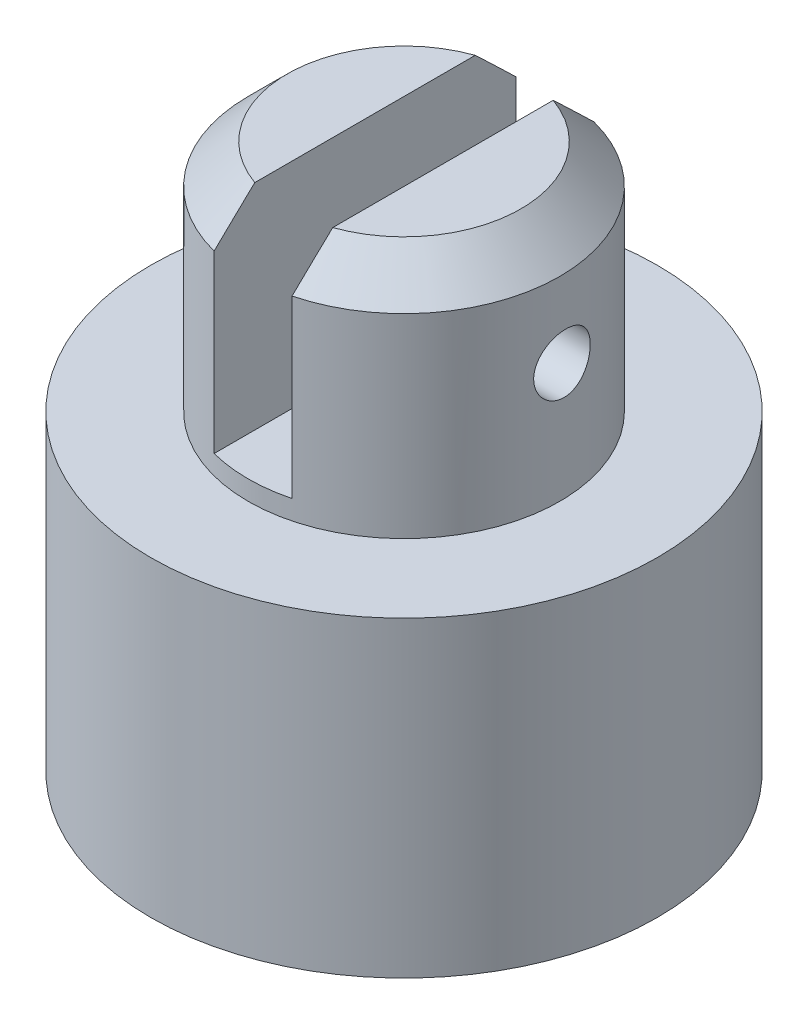
ISO-10303-21;
HEADER;
FILE_DESCRIPTION(('STEP AP214'),'2;1');
FILE_NAME('part.step','',(''),(''),'','','');
FILE_SCHEMA(('AUTOMOTIVE_DESIGN { 1 0 10303 214 1 1 1 1 }'));
ENDSEC;
DATA;
#1=APPLICATION_CONTEXT('core data for automotive mechanical design processes');
#2=APPLICATION_PROTOCOL_DEFINITION('international standard','automotive_design',2000,#1);
#3=PRODUCT_CONTEXT('',#1,'mechanical');
#4=PRODUCT('Part','Part','',(#3));
#5=PRODUCT_RELATED_PRODUCT_CATEGORY('part','',(#4));
#6=PRODUCT_DEFINITION_FORMATION('','',#4);
#7=PRODUCT_DEFINITION_CONTEXT('part definition',#1,'design');
#8=PRODUCT_DEFINITION('design','',#6,#7);
#9=PRODUCT_DEFINITION_SHAPE('','',#8);
#10=(LENGTH_UNIT() NAMED_UNIT(*) SI_UNIT(.MILLI.,.METRE.));
#11=(NAMED_UNIT(*) PLANE_ANGLE_UNIT() SI_UNIT($,.RADIAN.));
#12=(NAMED_UNIT(*) SI_UNIT($,.STERADIAN.) SOLID_ANGLE_UNIT());
#13=UNCERTAINTY_MEASURE_WITH_UNIT(LENGTH_MEASURE(1.E-05),#10,'distance_accuracy_value','');
#14=(GEOMETRIC_REPRESENTATION_CONTEXT(3) GLOBAL_UNCERTAINTY_ASSIGNED_CONTEXT((#13)) GLOBAL_UNIT_ASSIGNED_CONTEXT((#10,
#11,#12)) REPRESENTATION_CONTEXT('',''));
#15=CARTESIAN_POINT('',(0.,0.,0.));
#16=DIRECTION('',(0.,0.,1.));
#17=DIRECTION('',(1.,0.,0.));
#18=AXIS2_PLACEMENT_3D('',#15,#16,#17);
#19=CARTESIAN_POINT('',(0.,14.,0.));
#20=DIRECTION('',(0.,-1.,0.));
#21=DIRECTION('',(0.,0.,-1.));
#22=AXIS2_PLACEMENT_3D('',#19,#20,#21);
#23=CYLINDRICAL_SURFACE('',#22,4.);
#24=DIRECTION('',(0.,-1.,0.));
#25=VECTOR('',#24,1.);
#26=CARTESIAN_POINT('',(-1.,14.,3.87298334620742));
#27=LINE('',#26,#25);
#28=CARTESIAN_POINT('',(-1.,8.5,3.87298334620742));
#29=VERTEX_POINT('',#28);
#30=CARTESIAN_POINT('',(-1.,13.,3.87298334620742));
#31=VERTEX_POINT('',#30);
#32=EDGE_CURVE('E108',#29,#31,#27,.F.);
#33=ORIENTED_EDGE('',*,*,#32,.T.);
#34=CARTESIAN_POINT('',(0.,13.,0.));
#35=DIRECTION('',(0.,1.,0.));
#36=DIRECTION('',(0.,0.,1.));
#37=AXIS2_PLACEMENT_3D('',#34,#35,#36);
#38=CIRCLE('',#37,4.);
#39=CARTESIAN_POINT('',(-1.,13.,-3.87298334620742));
#40=VERTEX_POINT('',#39);
#41=EDGE_CURVE('E11',#31,#40,#38,.F.);
#42=ORIENTED_EDGE('',*,*,#41,.T.);
#43=DIRECTION('',(0.,-1.,0.));
#44=VECTOR('',#43,1.);
#45=CARTESIAN_POINT('',(-1.,14.,-3.87298334620742));
#46=LINE('',#45,#44);
#47=CARTESIAN_POINT('',(-1.,8.5,-3.87298334620742));
#48=VERTEX_POINT('',#47);
#49=EDGE_CURVE('E99',#40,#48,#46,.T.);
#50=ORIENTED_EDGE('',*,*,#49,.T.);
#51=CARTESIAN_POINT('',(0.,8.5,0.));
#52=DIRECTION('',(0.,-1.,0.));
#53=DIRECTION('',(0.,0.,-1.));
#54=AXIS2_PLACEMENT_3D('',#51,#52,#53);
#55=CIRCLE('',#54,4.);
#56=CARTESIAN_POINT('',(1.,8.5,-3.87298334620742));
#57=VERTEX_POINT('',#56);
#58=EDGE_CURVE('E103',#48,#57,#55,.T.);
#59=ORIENTED_EDGE('',*,*,#58,.T.);
#60=DIRECTION('',(0.,-1.,0.));
#61=VECTOR('',#60,1.);
#62=CARTESIAN_POINT('',(1.,14.,-3.87298334620742));
#63=LINE('',#62,#61);
#64=CARTESIAN_POINT('',(1.,13.,-3.87298334620742));
#65=VERTEX_POINT('',#64);
#66=EDGE_CURVE('E107',#57,#65,#63,.F.);
#67=ORIENTED_EDGE('',*,*,#66,.T.);
#68=CARTESIAN_POINT('',(0.,13.,0.));
#69=DIRECTION('',(0.,1.,0.));
#70=DIRECTION('',(0.,0.,1.));
#71=AXIS2_PLACEMENT_3D('',#68,#69,#70);
#72=CIRCLE('',#71,4.);
#73=CARTESIAN_POINT('',(1.,13.,3.87298334620742));
#74=VERTEX_POINT('',#73);
#75=EDGE_CURVE('E310',#65,#74,#72,.F.);
#76=ORIENTED_EDGE('',*,*,#75,.T.);
#77=DIRECTION('',(0.,-1.,0.));
#78=VECTOR('',#77,1.);
#79=CARTESIAN_POINT('',(1.,14.,3.87298334620742));
#80=LINE('',#79,#78);
#81=CARTESIAN_POINT('',(1.,8.5,3.87298334620742));
#82=VERTEX_POINT('',#81);
#83=EDGE_CURVE('E135',#74,#82,#80,.T.);
#84=ORIENTED_EDGE('',*,*,#83,.T.);
#85=EDGE_CURVE('E120',#82,#29,#55,.T.);
#86=ORIENTED_EDGE('',*,*,#85,.T.);
#87=EDGE_LOOP('',(#33,#42,#50,#59,#67,#76,#84,#86));
#88=FACE_BOUND('',#87,.T.);
#89=CARTESIAN_POINT('',(0.,8.,0.));
#90=DIRECTION('',(0.,1.,0.));
#91=DIRECTION('',(0.,0.,1.));
#92=AXIS2_PLACEMENT_3D('',#89,#90,#91);
#93=CIRCLE('',#92,4.);
#94=CARTESIAN_POINT('',(0.,8.,4.));
#95=VERTEX_POINT('',#94);
#96=EDGE_CURVE('E139',#95,#95,#93,.T.);
#97=ORIENTED_EDGE('',*,*,#96,.T.);
#98=EDGE_LOOP('',(#97));
#99=FACE_BOUND('',#98,.T.);
#100=CARTESIAN_POINT('',(-3.95118865031122,11.0026900778099,0.622983346207417));
#101=CARTESIAN_POINT('',(-3.95118940049982,11.0445645268681,0.622981765630022));
#102=CARTESIAN_POINT('',(-3.95174835865621,11.0864597613555,0.619464857560846));
#103=CARTESIAN_POINT('',(-3.95391234242121,11.1690733812183,0.605495914282408));
#104=CARTESIAN_POINT('',(-3.95551825089201,11.2097907430366,0.595038025815435));
#105=CARTESIAN_POINT('',(-3.95956139440314,11.2888457740998,0.567508407905394));
#106=CARTESIAN_POINT('',(-3.96199799144498,11.3271852430208,0.550441752868567));
#107=CARTESIAN_POINT('',(-3.96738184008181,11.4004559584785,0.51018800723455));
#108=CARTESIAN_POINT('',(-3.97032904218471,11.435387534824,0.487001509709321));
#109=CARTESIAN_POINT('',(-3.97636953863099,11.5011619296717,0.434942999350673));
#110=CARTESIAN_POINT('',(-3.97946380375205,11.5319702396767,0.406027486805999));
#111=CARTESIAN_POINT('',(-3.98535409024654,11.5883181765039,0.343422922733898));
#112=CARTESIAN_POINT('',(-3.98815010079008,11.6138576120397,0.309733697971881));
#113=CARTESIAN_POINT('',(-3.99304913938079,11.6590067447851,0.238407422398824));
#114=CARTESIAN_POINT('',(-3.99515016865386,11.6785993256832,0.200759388290542));
#115=CARTESIAN_POINT('',(-3.99830949294768,11.7111737842072,0.122663924341556));
#116=CARTESIAN_POINT('',(-3.99936788146841,11.7241562545517,0.0822167458654666));
#117=CARTESIAN_POINT('',(-4.00020763559692,11.7430051870143,0.000195675521091702));
#118=CARTESIAN_POINT('',(-4.00000417482884,11.7489551813082,-0.0413588684481135));
#119=CARTESIAN_POINT('',(-3.99826907018489,11.7538516719462,-0.124849128260603));
#120=CARTESIAN_POINT('',(-3.99673750381566,11.7527985769585,-0.166784821719142));
#121=CARTESIAN_POINT('',(-3.99242474200645,11.7437814406785,-0.249492379963243));
#122=CARTESIAN_POINT('',(-3.98965376688515,11.7358734353873,-0.290270919537891));
#123=CARTESIAN_POINT('',(-3.98306141989517,11.7134805061753,-0.369890084169926));
#124=CARTESIAN_POINT('',(-3.97923997861883,11.6989951476265,-0.408730580974229));
#125=CARTESIAN_POINT('',(-3.97081138853547,11.6636872900295,-0.483840678660912));
#126=CARTESIAN_POINT('',(-3.96619619103775,11.6427979641925,-0.520077940915066));
#127=CARTESIAN_POINT('',(-3.95661433685236,11.5953248968589,-0.588557860409326));
#128=CARTESIAN_POINT('',(-3.9516476386883,11.5687404826004,-0.620800044999232));
#129=CARTESIAN_POINT('',(-3.94173390278137,11.510096825401,-0.680940387177608));
#130=CARTESIAN_POINT('',(-3.93678858270496,11.477953463815,-0.708756885574619));
#131=CARTESIAN_POINT('',(-3.92748844360088,11.4093774328627,-0.758603620399381));
#132=CARTESIAN_POINT('',(-3.92313362070237,11.3729447916165,-0.780633894757959));
#133=CARTESIAN_POINT('',(-3.91546945935426,11.2968783944937,-0.818209983357272));
#134=CARTESIAN_POINT('',(-3.91215767555702,11.2572524035975,-0.833770992286772));
#135=CARTESIAN_POINT('',(-3.90691902404061,11.1758571461488,-0.857985364293892));
#136=CARTESIAN_POINT('',(-3.90499193635065,11.1340882211497,-0.866639824559883));
#137=CARTESIAN_POINT('',(-3.9027580047494,11.0505450625109,-0.876644678773477));
#138=CARTESIAN_POINT('',(-3.9024175872001,11.0087898187716,-0.87814643768443));
#139=CARTESIAN_POINT('',(-3.90330187101231,10.9256270854736,-0.874207335282675));
#140=CARTESIAN_POINT('',(-3.90452647090914,10.8842195735455,-0.868766924051305));
#141=CARTESIAN_POINT('',(-3.90838928812609,10.8033765516597,-0.851217779321313));
#142=CARTESIAN_POINT('',(-3.9110124107461,10.7639248117486,-0.839180212958625));
#143=CARTESIAN_POINT('',(-3.91739585181185,10.6876004052236,-0.808856217652719));
#144=CARTESIAN_POINT('',(-3.92115627050541,10.6507279663169,-0.790569237831854));
#145=CARTESIAN_POINT('',(-3.9295099514245,10.5799925535252,-0.747949506321918));
#146=CARTESIAN_POINT('',(-3.93411498558997,10.5461837363558,-0.723529225071214));
#147=CARTESIAN_POINT('',(-3.94367488652956,10.4830954605251,-0.669462781702335));
#148=CARTESIAN_POINT('',(-3.94862979669406,10.4538165650903,-0.639815970723738));
#149=CARTESIAN_POINT('',(-3.95852632625779,10.4000325557026,-0.575454518964815));
#150=CARTESIAN_POINT('',(-3.96346579814569,10.375631785095,-0.540652248512492));
#151=CARTESIAN_POINT('',(-3.97277303165706,10.3330227255565,-0.467372174198622));
#152=CARTESIAN_POINT('',(-3.9771408000104,10.3148143637269,-0.428894413612735));
#153=CARTESIAN_POINT('',(-3.98490974273012,10.2851675363338,-0.349405764371667));
#154=CARTESIAN_POINT('',(-3.98831281600615,10.2737157224002,-0.308400048317007));
#155=CARTESIAN_POINT('',(-3.99388761510479,10.2579023002905,-0.224963128185051));
#156=CARTESIAN_POINT('',(-3.99605948732144,10.2535398490498,-0.182532094218738));
#157=CARTESIAN_POINT('',(-3.99901170007667,10.2520785975358,-0.0982476282431107));
#158=CARTESIAN_POINT('',(-3.99981589099339,10.2548531343317,-0.0563971963163313));
#159=CARTESIAN_POINT('',(-4.00012734701381,10.267331123372,0.0262610267582336));
#160=CARTESIAN_POINT('',(-3.9996346646027,10.2770342951992,0.067068860033083));
#161=CARTESIAN_POINT('',(-3.99752245663428,10.3029894222628,0.146186939093485));
#162=CARTESIAN_POINT('',(-3.99591102229825,10.3191940039431,0.18451297179901));
#163=CARTESIAN_POINT('',(-3.99184489204582,10.3576827413647,0.25792962745631));
#164=CARTESIAN_POINT('',(-3.98939016016866,10.3799671563602,0.293020112353528));
#165=CARTESIAN_POINT('',(-3.98396420790981,10.4302617682621,0.359375690412011));
#166=CARTESIAN_POINT('',(-3.98098775039141,10.4583305863816,0.390595915709176));
#167=CARTESIAN_POINT('',(-3.97494564698705,10.5192768009474,0.44792884693684));
#168=CARTESIAN_POINT('',(-3.97187998036691,10.5521553225434,0.474040354418282));
#169=CARTESIAN_POINT('',(-3.96603796055325,10.622185304032,0.520675111298781));
#170=CARTESIAN_POINT('',(-3.96326495767936,10.6593777466971,0.541137247087162));
#171=CARTESIAN_POINT('',(-3.95842145372554,10.7366951954281,0.575502536911184));
#172=CARTESIAN_POINT('',(-3.95635032308833,10.7768175339884,0.589411573264925));
#173=CARTESIAN_POINT('',(-3.95360383376837,10.8479869037189,0.607515483074948));
#174=CARTESIAN_POINT('',(-3.95270423885226,10.8786293501436,0.613306291237051));
#175=CARTESIAN_POINT('',(-3.95149637376363,10.9404073966163,0.621040773923832));
#176=CARTESIAN_POINT('',(-3.95118809230526,10.9715429872407,0.622984521873925));
#177=CARTESIAN_POINT('',(-3.95118865031122,11.0026900778099,0.622983346207417));
#178=B_SPLINE_CURVE_WITH_KNOTS('',3,(#100,#101,#102,#103,#104,#105,#106,#107,#108,#109,#110,
#111,#112,#113,#114,#115,#116,#117,#118,#119,#120,#121,#122,#123,#124,#125,#126,#127,#128,#129,
#130,#131,#132,#133,#134,#135,#136,#137,#138,#139,#140,#141,#142,#143,#144,#145,#146,#147,#148,
#149,#150,#151,#152,#153,#154,#155,#156,#157,#158,#159,#160,#161,#162,#163,#164,#165,#166,#167,
#168,#169,#170,#171,#172,#173,#174,#175,#176,#177),.UNSPECIFIED.,.T.,.F.,(4,2,2,2,2,2,2,2,2,2,2,
2,2,2,2,2,2,2,2,2,2,2,2,2,2,2,2,2,2,2,2,2,2,2,2,2,2,2,4),(0.,0.125509811983547,
0.251125599814411,0.376645126772781,0.50215249413766,0.628652106124076,0.755156309866805,
0.882021240350222,1.0088747930432,1.1342059250148,1.25952974330303,1.38383865135034,
1.50815577485791,1.63381707607957,1.75949322988969,1.8872710015767,2.01504793561251,
2.14252303445885,2.26997787831813,2.39472317511976,2.51946038472726,2.64287774030543,
2.76630597776989,2.89160715130898,3.01692389163991,3.14468687789115,3.27244836003111,
3.39995658144718,3.52744963851537,3.65269569792766,3.77793668863974,3.90228120053025,
4.02663101550748,4.1523091630798,4.27801675810669,4.40503522797711,4.53193946284685,
4.62529806657562,4.7186548884346),.UNSPECIFIED.);
#179=CARTESIAN_POINT('',(-3.95118865031122,11.0026900778099,0.622983346207417));
#180=VERTEX_POINT('',#179);
#181=EDGE_CURVE('E200',#180,#180,#178,.T.);
#182=ORIENTED_EDGE('',*,*,#181,.F.);
#183=EDGE_LOOP('',(#182));
#184=FACE_BOUND('',#183,.T.);
#185=CARTESIAN_POINT('',(3.95118865031122,11.0026900778099,0.622983346207417));
#186=CARTESIAN_POINT('',(3.95118940049982,10.9608156287517,0.622981765630022));
#187=CARTESIAN_POINT('',(3.95174835865621,10.9189203942643,0.619464857560846));
#188=CARTESIAN_POINT('',(3.95391234242121,10.8363067744015,0.605495914282408));
#189=CARTESIAN_POINT('',(3.95551825089201,10.7955894125832,0.595038025815436));
#190=CARTESIAN_POINT('',(3.95956139440314,10.71653438152,0.567508407905394));
#191=CARTESIAN_POINT('',(3.96199799144498,10.678194912599,0.550441752868567));
#192=CARTESIAN_POINT('',(3.96738184008181,10.6049241971412,0.51018800723455));
#193=CARTESIAN_POINT('',(3.97032904218471,10.5699926207958,0.487001509709321));
#194=CARTESIAN_POINT('',(3.97636953863099,10.5042182259481,0.434942999350673));
#195=CARTESIAN_POINT('',(3.97946380375205,10.473409915943,0.406027486805999));
#196=CARTESIAN_POINT('',(3.98535409024654,10.4170619791158,0.343422922733898));
#197=CARTESIAN_POINT('',(3.98815010079008,10.39152254358,0.309733697971881));
#198=CARTESIAN_POINT('',(3.99304913938079,10.3463734108346,0.238407422398824));
#199=CARTESIAN_POINT('',(3.99515016865386,10.3267808299365,0.200759388290542));
#200=CARTESIAN_POINT('',(3.99830949294768,10.2942063714126,0.122663924341556));
#201=CARTESIAN_POINT('',(3.99936788146841,10.2812239010681,0.0822167458654666));
#202=CARTESIAN_POINT('',(4.00020763559692,10.2623749686054,0.000195675521091729));
#203=CARTESIAN_POINT('',(4.00000417482884,10.2564249743116,-0.0413588684481134));
#204=CARTESIAN_POINT('',(3.99826907018489,10.2515284836735,-0.124849128260603));
#205=CARTESIAN_POINT('',(3.99673750381566,10.2525815786613,-0.166784821719142));
#206=CARTESIAN_POINT('',(3.99242474200645,10.2615987149413,-0.249492379963243));
#207=CARTESIAN_POINT('',(3.98965376688515,10.2695067202325,-0.290270919537891));
#208=CARTESIAN_POINT('',(3.98306141989517,10.2918996494445,-0.369890084169926));
#209=CARTESIAN_POINT('',(3.97923997861883,10.3063850079932,-0.408730580974229));
#210=CARTESIAN_POINT('',(3.97081138853547,10.3416928655903,-0.483840678660912));
#211=CARTESIAN_POINT('',(3.96619619103775,10.3625821914273,-0.520077940915066));
#212=CARTESIAN_POINT('',(3.95661433685236,10.4100552587609,-0.588557860409326));
#213=CARTESIAN_POINT('',(3.9516476386883,10.4366396730194,-0.620800044999232));
#214=CARTESIAN_POINT('',(3.94173390278137,10.4952833302188,-0.680940387177608));
#215=CARTESIAN_POINT('',(3.93678858270496,10.5274266918048,-0.708756885574619));
#216=CARTESIAN_POINT('',(3.92748844360088,10.5960027227571,-0.758603620399381));
#217=CARTESIAN_POINT('',(3.92313362070237,10.6324353640033,-0.780633894757959));
#218=CARTESIAN_POINT('',(3.91546945935426,10.7085017611261,-0.818209983357272));
#219=CARTESIAN_POINT('',(3.91215767555702,10.7481277520223,-0.833770992286772));
#220=CARTESIAN_POINT('',(3.90691902404061,10.829523009471,-0.857985364293892));
#221=CARTESIAN_POINT('',(3.90499193635065,10.8712919344701,-0.866639824559883));
#222=CARTESIAN_POINT('',(3.9027580047494,10.9548350931088,-0.876644678773477));
#223=CARTESIAN_POINT('',(3.9024175872001,10.9965903368481,-0.87814643768443));
#224=CARTESIAN_POINT('',(3.90330187101231,11.0797530701462,-0.874207335282675));
#225=CARTESIAN_POINT('',(3.90452647090914,11.1211605820742,-0.868766924051305));
#226=CARTESIAN_POINT('',(3.90838928812609,11.2020036039601,-0.851217779321313));
#227=CARTESIAN_POINT('',(3.9110124107461,11.2414553438711,-0.839180212958625));
#228=CARTESIAN_POINT('',(3.91739585181185,11.3177797503962,-0.808856217652719));
#229=CARTESIAN_POINT('',(3.92115627050541,11.3546521893029,-0.790569237831854));
#230=CARTESIAN_POINT('',(3.9295099514245,11.4253876020946,-0.747949506321918));
#231=CARTESIAN_POINT('',(3.93411498558997,11.4591964192639,-0.723529225071214));
#232=CARTESIAN_POINT('',(3.94367488652956,11.5222846950947,-0.669462781702335));
#233=CARTESIAN_POINT('',(3.94862979669406,11.5515635905295,-0.639815970723738));
#234=CARTESIAN_POINT('',(3.95852632625779,11.6053475999172,-0.575454518964815));
#235=CARTESIAN_POINT('',(3.96346579814569,11.6297483705248,-0.540652248512492));
#236=CARTESIAN_POINT('',(3.97277303165706,11.6723574300633,-0.467372174198622));
#237=CARTESIAN_POINT('',(3.9771408000104,11.6905657918928,-0.428894413612735));
#238=CARTESIAN_POINT('',(3.98490974273012,11.7202126192859,-0.349405764371667));
#239=CARTESIAN_POINT('',(3.98831281600615,11.7316644332196,-0.308400048317007));
#240=CARTESIAN_POINT('',(3.99388761510479,11.7474778553292,-0.224963128185051));
#241=CARTESIAN_POINT('',(3.99605948732144,11.75184030657,-0.182532094218738));
#242=CARTESIAN_POINT('',(3.99901170007667,11.753301558084,-0.0982476282431107));
#243=CARTESIAN_POINT('',(3.99981589099339,11.7505270212881,-0.0563971963163313));
#244=CARTESIAN_POINT('',(4.00012734701381,11.7380490322478,0.0262610267582336));
#245=CARTESIAN_POINT('',(3.9996346646027,11.7283458604206,0.067068860033083));
#246=CARTESIAN_POINT('',(3.99752245663428,11.702390733357,0.146186939093485));
#247=CARTESIAN_POINT('',(3.99591102229825,11.6861861516766,0.18451297179901));
#248=CARTESIAN_POINT('',(3.99184489204582,11.6476974142551,0.25792962745631));
#249=CARTESIAN_POINT('',(3.98939016016866,11.6254129992596,0.293020112353528));
#250=CARTESIAN_POINT('',(3.98396420790981,11.5751183873577,0.359375690412011));
#251=CARTESIAN_POINT('',(3.98098775039141,11.5470495692382,0.390595915709176));
#252=CARTESIAN_POINT('',(3.97494564698705,11.4861033546724,0.44792884693684));
#253=CARTESIAN_POINT('',(3.97187998036691,11.4532248330764,0.474040354418282));
#254=CARTESIAN_POINT('',(3.96603796055325,11.3831948515878,0.520675111298781));
#255=CARTESIAN_POINT('',(3.96326495767936,11.3460024089226,0.541137247087162));
#256=CARTESIAN_POINT('',(3.95842145372554,11.2686849601917,0.575502536911184));
#257=CARTESIAN_POINT('',(3.95635032308833,11.2285626216314,0.589411573264925));
#258=CARTESIAN_POINT('',(3.95360383376837,11.1573932519009,0.607515483074948));
#259=CARTESIAN_POINT('',(3.95270423885226,11.1267508054762,0.613306291237051));
#260=CARTESIAN_POINT('',(3.95149637376363,11.0649727590035,0.621040773923832));
#261=CARTESIAN_POINT('',(3.95118809230526,11.0338371683791,0.622984521873925));
#262=CARTESIAN_POINT('',(3.95118865031122,11.0026900778099,0.622983346207417));
#263=B_SPLINE_CURVE_WITH_KNOTS('',3,(#185,#186,#187,#188,#189,#190,#191,#192,#193,#194,#195,
#196,#197,#198,#199,#200,#201,#202,#203,#204,#205,#206,#207,#208,#209,#210,#211,#212,#213,#214,
#215,#216,#217,#218,#219,#220,#221,#222,#223,#224,#225,#226,#227,#228,#229,#230,#231,#232,#233,
#234,#235,#236,#237,#238,#239,#240,#241,#242,#243,#244,#245,#246,#247,#248,#249,#250,#251,#252,
#253,#254,#255,#256,#257,#258,#259,#260,#261,#262),.UNSPECIFIED.,.T.,.F.,(4,2,2,2,2,2,2,2,2,2,2,
2,2,2,2,2,2,2,2,2,2,2,2,2,2,2,2,2,2,2,2,2,2,2,2,2,2,2,4),(0.,0.125509811983545,
0.251125599814411,0.376645126772781,0.50215249413766,0.628652106124076,0.755156309866805,
0.882021240350222,1.0088747930432,1.1342059250148,1.25952974330303,1.38383865135034,
1.50815577485791,1.63381707607957,1.75949322988969,1.8872710015767,2.01504793561251,
2.14252303445885,2.26997787831813,2.39472317511976,2.51946038472726,2.64287774030543,
2.76630597776989,2.89160715130898,3.01692389163991,3.14468687789115,3.27244836003111,
3.39995658144718,3.52744963851537,3.65269569792766,3.77793668863974,3.90228120053025,
4.02663101550748,4.1523091630798,4.27801675810669,4.40503522797711,4.53193946284685,
4.62529806657562,4.7186548884346),.UNSPECIFIED.);
#264=CARTESIAN_POINT('',(3.95118865031122,11.0026900778099,0.622983346207417));
#265=VERTEX_POINT('',#264);
#266=EDGE_CURVE('E129',#265,#265,#263,.T.);
#267=ORIENTED_EDGE('',*,*,#266,.F.);
#268=EDGE_LOOP('',(#267));
#269=FACE_BOUND('',#268,.T.);
#270=ADVANCED_FACE('F47',(#88,#99,#184,#269),#23,.T.);
#271=CARTESIAN_POINT('',(0.,14.,0.));
#272=DIRECTION('',(0.,1.,0.));
#273=DIRECTION('',(0.,0.,1.));
#274=AXIS2_PLACEMENT_3D('',#271,#272,#273);
#275=PLANE('',#274);
#276=DIRECTION('',(0.,0.,-1.));
#277=VECTOR('',#276,1.);
#278=CARTESIAN_POINT('',(1.,14.,0.));
#279=LINE('',#278,#277);
#280=CARTESIAN_POINT('',(1.,14.,2.82842712474619));
#281=VERTEX_POINT('',#280);
#282=CARTESIAN_POINT('',(1.,14.,-2.82842712474619));
#283=VERTEX_POINT('',#282);
#284=EDGE_CURVE('E121',#281,#283,#279,.T.);
#285=ORIENTED_EDGE('',*,*,#284,.F.);
#286=CARTESIAN_POINT('',(0.,14.,0.));
#287=DIRECTION('',(0.,1.,0.));
#288=DIRECTION('',(0.,0.,1.));
#289=AXIS2_PLACEMENT_3D('',#286,#287,#288);
#290=CIRCLE('',#289,3.);
#291=EDGE_CURVE('E156',#281,#283,#290,.T.);
#292=ORIENTED_EDGE('',*,*,#291,.T.);
#293=EDGE_LOOP('',(#285,#292));
#294=FACE_BOUND('',#293,.T.);
#295=ADVANCED_FACE('F192',(#294),#275,.T.);
#296=CARTESIAN_POINT('',(0.,8.,0.));
#297=DIRECTION('',(0.,-1.,0.));
#298=DIRECTION('',(0.,0.,-1.));
#299=AXIS2_PLACEMENT_3D('',#296,#297,#298);
#300=CYLINDRICAL_SURFACE('',#299,6.5);
#301=CARTESIAN_POINT('',(0.,8.,0.));
#302=DIRECTION('',(0.,1.,0.));
#303=DIRECTION('',(0.,0.,1.));
#304=AXIS2_PLACEMENT_3D('',#301,#302,#303);
#305=CIRCLE('',#304,6.5);
#306=CARTESIAN_POINT('',(0.,8.,6.5));
#307=VERTEX_POINT('',#306);
#308=EDGE_CURVE('E144',#307,#307,#305,.T.);
#309=ORIENTED_EDGE('',*,*,#308,.F.);
#310=EDGE_LOOP('',(#309));
#311=FACE_BOUND('',#310,.T.);
#312=CARTESIAN_POINT('',(0.,0.,0.));
#313=DIRECTION('',(0.,1.,0.));
#314=DIRECTION('',(0.,0.,1.));
#315=AXIS2_PLACEMENT_3D('',#312,#313,#314);
#316=CIRCLE('',#315,6.5);
#317=CARTESIAN_POINT('',(0.,0.,6.5));
#318=VERTEX_POINT('',#317);
#319=EDGE_CURVE('E138',#318,#318,#316,.T.);
#320=ORIENTED_EDGE('',*,*,#319,.T.);
#321=EDGE_LOOP('',(#320));
#322=FACE_BOUND('',#321,.T.);
#323=ADVANCED_FACE('F233',(#311,#322),#300,.T.);
#324=CARTESIAN_POINT('',(0.,8.,0.));
#325=DIRECTION('',(0.,1.,0.));
#326=DIRECTION('',(0.,0.,1.));
#327=AXIS2_PLACEMENT_3D('',#324,#325,#326);
#328=PLANE('',#327);
#329=ORIENTED_EDGE('',*,*,#96,.F.);
#330=EDGE_LOOP('',(#329));
#331=FACE_BOUND('',#330,.T.);
#332=ORIENTED_EDGE('',*,*,#308,.T.);
#333=EDGE_LOOP('',(#332));
#334=FACE_BOUND('',#333,.T.);
#335=ADVANCED_FACE('F196',(#331,#334),#328,.T.);
#336=CARTESIAN_POINT('',(0.,0.,0.));
#337=DIRECTION('',(0.,1.,0.));
#338=DIRECTION('',(0.,0.,1.));
#339=AXIS2_PLACEMENT_3D('',#336,#337,#338);
#340=PLANE('',#339);
#341=ORIENTED_EDGE('',*,*,#319,.F.);
#342=EDGE_LOOP('',(#341));
#343=FACE_BOUND('',#342,.T.);
#344=ADVANCED_FACE('F190',(#343),#340,.F.);
#345=DIRECTION('',(0.,0.,1.));
#346=VECTOR('',#345,1.);
#347=CARTESIAN_POINT('',(-1.,14.,0.));
#348=LINE('',#347,#346);
#349=CARTESIAN_POINT('',(-1.,14.,-2.82842712474619));
#350=VERTEX_POINT('',#349);
#351=CARTESIAN_POINT('',(-1.,14.,2.82842712474619));
#352=VERTEX_POINT('',#351);
#353=EDGE_CURVE('E143',#350,#352,#348,.T.);
#354=ORIENTED_EDGE('',*,*,#353,.F.);
#355=CARTESIAN_POINT('',(0.,14.,0.));
#356=DIRECTION('',(0.,1.,0.));
#357=DIRECTION('',(0.,0.,1.));
#358=AXIS2_PLACEMENT_3D('',#355,#356,#357);
#359=CIRCLE('',#358,3.);
#360=EDGE_CURVE('E313',#350,#352,#359,.T.);
#361=ORIENTED_EDGE('',*,*,#360,.T.);
#362=EDGE_LOOP('',(#354,#361));
#363=FACE_BOUND('',#362,.T.);
#364=ADVANCED_FACE('F186',(#363),#275,.T.);
#365=CARTESIAN_POINT('',(0.,8.5,0.));
#366=DIRECTION('',(0.,-1.,0.));
#367=DIRECTION('',(0.,0.,-1.));
#368=AXIS2_PLACEMENT_3D('',#365,#366,#367);
#369=PLANE('',#368);
#370=DIRECTION('',(0.,0.,-1.));
#371=VECTOR('',#370,1.);
#372=CARTESIAN_POINT('',(1.,8.5,4.5));
#373=LINE('',#372,#371);
#374=EDGE_CURVE('E118',#82,#57,#373,.T.);
#375=ORIENTED_EDGE('',*,*,#374,.T.);
#376=ORIENTED_EDGE('',*,*,#58,.F.);
#377=DIRECTION('',(0.,0.,1.));
#378=VECTOR('',#377,1.);
#379=CARTESIAN_POINT('',(-1.,8.5,4.5));
#380=LINE('',#379,#378);
#381=EDGE_CURVE('E115',#48,#29,#380,.T.);
#382=ORIENTED_EDGE('',*,*,#381,.T.);
#383=ORIENTED_EDGE('',*,*,#85,.F.);
#384=EDGE_LOOP('',(#375,#376,#382,#383));
#385=FACE_BOUND('',#384,.T.);
#386=ADVANCED_FACE('F113',(#385),#369,.F.);
#387=CARTESIAN_POINT('',(1.,8.5,4.5));
#388=DIRECTION('',(1.,0.,0.));
#389=DIRECTION('',(0.,0.,-1.));
#390=AXIS2_PLACEMENT_3D('',#387,#388,#389);
#391=PLANE('',#390);
#392=CARTESIAN_POINT('',(1.,11.0026900778099,-0.127016653792583));
#393=DIRECTION('',(1.,0.,0.));
#394=DIRECTION('',(0.,0.,-1.));
#395=AXIS2_PLACEMENT_3D('',#392,#393,#394);
#396=CIRCLE('',#395,0.750000000000001);
#397=CARTESIAN_POINT('',(1.,11.0026900778099,-0.877016653792584));
#398=VERTEX_POINT('',#397);
#399=EDGE_CURVE('E298',#398,#398,#396,.F.);
#400=ORIENTED_EDGE('',*,*,#399,.F.);
#401=EDGE_LOOP('',(#400));
#402=FACE_BOUND('',#401,.T.);
#403=ORIENTED_EDGE('',*,*,#284,.T.);
#404=CARTESIAN_POINT('',(1.,14.,-2.82842712474619));
#405=CARTESIAN_POINT('',(1.,13.9173278241128,-2.91610449432989));
#406=CARTESIAN_POINT('',(1.,13.8344398606193,-3.00357771454771));
#407=CARTESIAN_POINT('',(1.,13.6683124233808,-3.17818804342029));
#408=CARTESIAN_POINT('',(1.,13.5850729534034,-3.26532515565861));
#409=CARTESIAN_POINT('',(1.,13.4183211468699,-3.43933696230942));
#410=CARTESIAN_POINT('',(1.,13.3348088114604,-3.5262116578216));
#411=CARTESIAN_POINT('',(1.,13.1675599008437,-3.69974675114703));
#412=CARTESIAN_POINT('',(1.,13.0838233232633,-3.78640714667328));
#413=CARTESIAN_POINT('',(1.,13.,-3.87298334620742));
#414=B_SPLINE_CURVE_WITH_KNOTS('',3,(#404,#405,#406,#407,#408,#409,#410,#411,#412,#413),
.UNSPECIFIED.,.F.,.F.,(4,2,2,2,4),(0.,0.361520831328916,0.723037797429502,1.08455324641449,
1.44607253693401),.UNSPECIFIED.);
#415=EDGE_CURVE('E168',#283,#65,#414,.T.);
#416=ORIENTED_EDGE('',*,*,#415,.T.);
#417=ORIENTED_EDGE('',*,*,#66,.F.);
#418=ORIENTED_EDGE('',*,*,#374,.F.);
#419=ORIENTED_EDGE('',*,*,#83,.F.);
#420=CARTESIAN_POINT('',(1.,13.,3.87298334620742));
#421=CARTESIAN_POINT('',(1.,13.0838233232633,3.78640714667328));
#422=CARTESIAN_POINT('',(1.,13.1675599008437,3.69974675114702));
#423=CARTESIAN_POINT('',(1.,13.3348088114604,3.5262116578216));
#424=CARTESIAN_POINT('',(1.,13.4183211468699,3.43933696230942));
#425=CARTESIAN_POINT('',(1.,13.5850729534034,3.26532515565861));
#426=CARTESIAN_POINT('',(1.,13.6683124233808,3.17818804342029));
#427=CARTESIAN_POINT('',(1.,13.8344398606193,3.00357771454771));
#428=CARTESIAN_POINT('',(1.,13.9173278241128,2.91610449432989));
#429=CARTESIAN_POINT('',(1.,14.,2.82842712474619));
#430=B_SPLINE_CURVE_WITH_KNOTS('',3,(#420,#421,#422,#423,#424,#425,#426,#427,#428,#429),
.UNSPECIFIED.,.F.,.F.,(4,2,2,2,4),(0.,0.361519290519526,0.723034739504509,1.08455170560509,
1.44607253693401),.UNSPECIFIED.);
#431=EDGE_CURVE('E160',#74,#281,#430,.T.);
#432=ORIENTED_EDGE('',*,*,#431,.T.);
#433=EDGE_LOOP('',(#403,#416,#417,#418,#419,#432));
#434=FACE_BOUND('',#433,.T.);
#435=ADVANCED_FACE('F178',(#402,#434),#391,.F.);
#436=CARTESIAN_POINT('',(-1.,8.5,4.5));
#437=DIRECTION('',(-1.,0.,0.));
#438=DIRECTION('',(0.,0.,1.));
#439=AXIS2_PLACEMENT_3D('',#436,#437,#438);
#440=PLANE('',#439);
#441=CARTESIAN_POINT('',(-0.999999999999999,11.0026900778099,-0.127016653792583));
#442=DIRECTION('',(-1.,0.,0.));
#443=DIRECTION('',(0.,0.,1.));
#444=AXIS2_PLACEMENT_3D('',#441,#442,#443);
#445=CIRCLE('',#444,0.750000000000001);
#446=CARTESIAN_POINT('',(-0.999999999999999,11.0026900778099,0.622983346207417));
#447=VERTEX_POINT('',#446);
#448=EDGE_CURVE('E53',#447,#447,#445,.F.);
#449=ORIENTED_EDGE('',*,*,#448,.F.);
#450=EDGE_LOOP('',(#449));
#451=FACE_BOUND('',#450,.T.);
#452=ORIENTED_EDGE('',*,*,#353,.T.);
#453=CARTESIAN_POINT('',(-1.,14.,2.82842712474619));
#454=CARTESIAN_POINT('',(-1.,13.9173278241128,2.91610449432989));
#455=CARTESIAN_POINT('',(-1.,13.8344398606193,3.00357771454771));
#456=CARTESIAN_POINT('',(-1.,13.6683124233808,3.17818804342029));
#457=CARTESIAN_POINT('',(-1.,13.5850729534034,3.26532515565861));
#458=CARTESIAN_POINT('',(-1.,13.4183211468699,3.43933696230942));
#459=CARTESIAN_POINT('',(-1.,13.3348088114604,3.5262116578216));
#460=CARTESIAN_POINT('',(-1.,13.1675599008437,3.69974675114702));
#461=CARTESIAN_POINT('',(-1.,13.0838233232633,3.78640714667328));
#462=CARTESIAN_POINT('',(-1.,13.,3.87298334620742));
#463=B_SPLINE_CURVE_WITH_KNOTS('',3,(#453,#454,#455,#456,#457,#458,#459,#460,#461,#462),
.UNSPECIFIED.,.F.,.F.,(4,2,2,2,4),(0.,0.361520831328916,0.723037797429502,1.08455324641448,
1.44607253693401),.UNSPECIFIED.);
#464=EDGE_CURVE('E59',#352,#31,#463,.T.);
#465=ORIENTED_EDGE('',*,*,#464,.T.);
#466=ORIENTED_EDGE('',*,*,#32,.F.);
#467=ORIENTED_EDGE('',*,*,#381,.F.);
#468=ORIENTED_EDGE('',*,*,#49,.F.);
#469=CARTESIAN_POINT('',(-1.,13.,-3.87298334620742));
#470=CARTESIAN_POINT('',(-1.,13.0838233232633,-3.78640714667328));
#471=CARTESIAN_POINT('',(-1.,13.1675599008437,-3.69974675114702));
#472=CARTESIAN_POINT('',(-1.,13.3348088114604,-3.5262116578216));
#473=CARTESIAN_POINT('',(-1.,13.4183211468699,-3.43933696230942));
#474=CARTESIAN_POINT('',(-1.,13.5850729534034,-3.26532515565861));
#475=CARTESIAN_POINT('',(-1.,13.6683124233808,-3.17818804342029));
#476=CARTESIAN_POINT('',(-1.,13.8344398606193,-3.00357771454771));
#477=CARTESIAN_POINT('',(-1.,13.9173278241128,-2.91610449432989));
#478=CARTESIAN_POINT('',(-1.,14.,-2.82842712474619));
#479=B_SPLINE_CURVE_WITH_KNOTS('',3,(#469,#470,#471,#472,#473,#474,#475,#476,#477,#478),
.UNSPECIFIED.,.F.,.F.,(4,2,2,2,4),(0.,0.361519290519526,0.723034739504509,1.08455170560509,
1.44607253693401),.UNSPECIFIED.);
#480=EDGE_CURVE('E316',#40,#350,#479,.T.);
#481=ORIENTED_EDGE('',*,*,#480,.T.);
#482=EDGE_LOOP('',(#452,#465,#466,#467,#468,#481));
#483=FACE_BOUND('',#482,.T.);
#484=ADVANCED_FACE('F123',(#451,#483),#440,.F.);
#485=CARTESIAN_POINT('',(0.,14.,0.));
#486=DIRECTION('',(0.,-1.,0.));
#487=DIRECTION('',(0.,0.,-1.));
#488=AXIS2_PLACEMENT_3D('',#485,#486,#487);
#489=CONICAL_SURFACE('',#488,3.,0.785398163397447);
#490=ORIENTED_EDGE('',*,*,#431,.F.);
#491=ORIENTED_EDGE('',*,*,#75,.F.);
#492=ORIENTED_EDGE('',*,*,#415,.F.);
#493=ORIENTED_EDGE('',*,*,#291,.F.);
#494=EDGE_LOOP('',(#490,#491,#492,#493));
#495=FACE_BOUND('',#494,.T.);
#496=ADVANCED_FACE('F175',(#495),#489,.T.);
#497=CARTESIAN_POINT('',(0.,14.,0.));
#498=DIRECTION('',(0.,-1.,0.));
#499=DIRECTION('',(0.,0.,-1.));
#500=AXIS2_PLACEMENT_3D('',#497,#498,#499);
#501=CONICAL_SURFACE('',#500,3.,0.785398163397447);
#502=ORIENTED_EDGE('',*,*,#480,.F.);
#503=ORIENTED_EDGE('',*,*,#41,.F.);
#504=ORIENTED_EDGE('',*,*,#464,.F.);
#505=ORIENTED_EDGE('',*,*,#360,.F.);
#506=EDGE_LOOP('',(#502,#503,#504,#505));
#507=FACE_BOUND('',#506,.T.);
#508=ADVANCED_FACE('F50',(#507),#501,.T.);
#509=CARTESIAN_POINT('',(5.5,11.0026900778099,-0.127016653792583));
#510=DIRECTION('',(-1.,0.,0.));
#511=DIRECTION('',(0.,0.,1.));
#512=AXIS2_PLACEMENT_3D('',#509,#510,#511);
#513=CYLINDRICAL_SURFACE('',#512,0.750000000000001);
#514=ORIENTED_EDGE('',*,*,#448,.T.);
#515=EDGE_LOOP('',(#514));
#516=FACE_BOUND('',#515,.T.);
#517=ORIENTED_EDGE('',*,*,#181,.T.);
#518=EDGE_LOOP('',(#517));
#519=FACE_BOUND('',#518,.T.);
#520=ADVANCED_FACE('F214',(#516,#519),#513,.F.);
#521=ORIENTED_EDGE('',*,*,#399,.T.);
#522=EDGE_LOOP('',(#521));
#523=FACE_BOUND('',#522,.T.);
#524=ORIENTED_EDGE('',*,*,#266,.T.);
#525=EDGE_LOOP('',(#524));
#526=FACE_BOUND('',#525,.T.);
#527=ADVANCED_FACE('F211',(#523,#526),#513,.F.);
#528=CLOSED_SHELL('',(#270,#295,#323,#335,#344,#364,#386,#435,#484,#496,#508,#520,#527));
#529=MANIFOLD_SOLID_BREP('B2',#528);
#530=ADVANCED_BREP_SHAPE_REPRESENTATION('',(#18,#529),#14);
#531=SHAPE_DEFINITION_REPRESENTATION(#9,#530);
ENDSEC;
END-ISO-10303-21;
